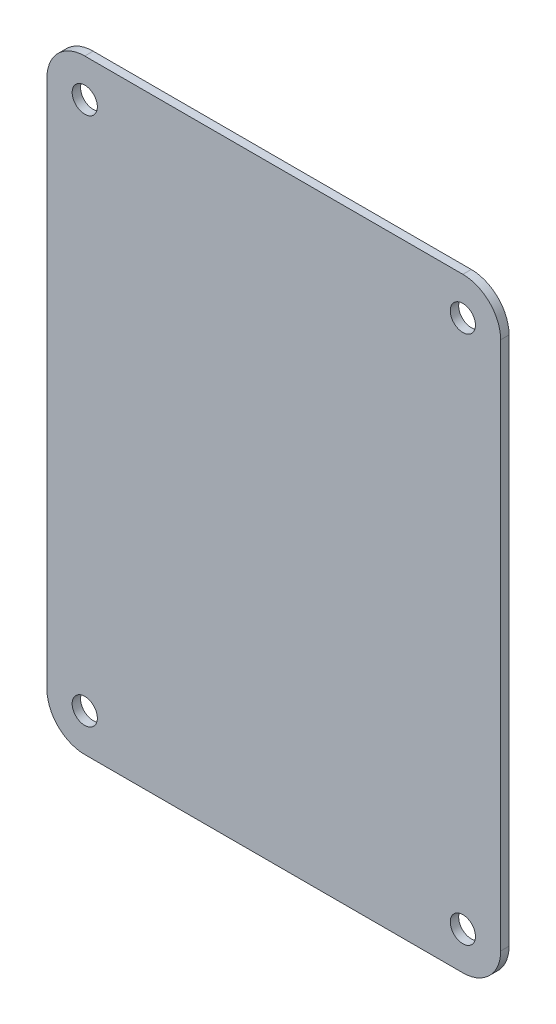
ISO-10303-21;
HEADER;
FILE_DESCRIPTION(('STEP AP214'),'2;1');
FILE_NAME('part.step','',(''),(''),'','','');
FILE_SCHEMA(('AUTOMOTIVE_DESIGN { 1 0 10303 214 1 1 1 1 }'));
ENDSEC;
DATA;
#1=APPLICATION_CONTEXT('core data for automotive mechanical design processes');
#2=APPLICATION_PROTOCOL_DEFINITION('international standard','automotive_design',2000,#1);
#3=PRODUCT_CONTEXT('',#1,'mechanical');
#4=PRODUCT('Part','Part','',(#3));
#5=PRODUCT_RELATED_PRODUCT_CATEGORY('part','',(#4));
#6=PRODUCT_DEFINITION_FORMATION('','',#4);
#7=PRODUCT_DEFINITION_CONTEXT('part definition',#1,'design');
#8=PRODUCT_DEFINITION('design','',#6,#7);
#9=PRODUCT_DEFINITION_SHAPE('','',#8);
#10=(LENGTH_UNIT() NAMED_UNIT(*) SI_UNIT(.MILLI.,.METRE.));
#11=(NAMED_UNIT(*) PLANE_ANGLE_UNIT() SI_UNIT($,.RADIAN.));
#12=(NAMED_UNIT(*) SI_UNIT($,.STERADIAN.) SOLID_ANGLE_UNIT());
#13=UNCERTAINTY_MEASURE_WITH_UNIT(LENGTH_MEASURE(1.E-05),#10,'distance_accuracy_value','');
#14=(GEOMETRIC_REPRESENTATION_CONTEXT(3) GLOBAL_UNCERTAINTY_ASSIGNED_CONTEXT((#13)) GLOBAL_UNIT_ASSIGNED_CONTEXT((#10,
#11,#12)) REPRESENTATION_CONTEXT('',''));
#15=CARTESIAN_POINT('',(0.,0.,0.));
#16=DIRECTION('',(0.,0.,1.));
#17=DIRECTION('',(1.,0.,0.));
#18=AXIS2_PLACEMENT_3D('',#15,#16,#17);
#19=CARTESIAN_POINT('',(-101.443383637,119.056539338,1.));
#20=DIRECTION('',(0.,0.,1.));
#21=DIRECTION('',(1.,0.,0.));
#22=AXIS2_PLACEMENT_3D('',#19,#20,#21);
#23=PLANE('',#22);
#24=CARTESIAN_POINT('',(-101.443383637,56.056539338,1.));
#25=DIRECTION('',(0.,0.,1.));
#26=DIRECTION('',(1.,0.,0.));
#27=AXIS2_PLACEMENT_3D('',#24,#25,#26);
#28=CIRCLE('',#27,1.5);
#29=CARTESIAN_POINT('',(-99.943383637,56.056539338,1.));
#30=VERTEX_POINT('',#29);
#31=EDGE_CURVE('E188',#30,#30,#28,.T.);
#32=ORIENTED_EDGE('',*,*,#31,.F.);
#33=EDGE_LOOP('',(#32));
#34=FACE_BOUND('',#33,.T.);
#35=CARTESIAN_POINT('',(-101.443383637,119.056539338,1.));
#36=DIRECTION('',(0.,0.,1.));
#37=DIRECTION('',(1.,0.,0.));
#38=AXIS2_PLACEMENT_3D('',#35,#36,#37);
#39=CIRCLE('',#38,1.5);
#40=CARTESIAN_POINT('',(-99.943383637,119.056539338,1.));
#41=VERTEX_POINT('',#40);
#42=EDGE_CURVE('E134',#41,#41,#39,.T.);
#43=ORIENTED_EDGE('',*,*,#42,.F.);
#44=EDGE_LOOP('',(#43));
#45=FACE_BOUND('',#44,.T.);
#46=CARTESIAN_POINT('',(-101.443383637,119.056539338,1.));
#47=DIRECTION('',(0.,0.,1.));
#48=DIRECTION('',(1.,0.,0.));
#49=AXIS2_PLACEMENT_3D('',#46,#47,#48);
#50=CIRCLE('',#49,4.5);
#51=CARTESIAN_POINT('',(-101.443383637,123.556539338,1.));
#52=VERTEX_POINT('',#51);
#53=CARTESIAN_POINT('',(-105.943383637,119.056539338,1.));
#54=VERTEX_POINT('',#53);
#55=EDGE_CURVE('E145',#52,#54,#50,.T.);
#56=ORIENTED_EDGE('',*,*,#55,.T.);
#57=DIRECTION('',(0.,-1.,0.));
#58=VECTOR('',#57,1.);
#59=CARTESIAN_POINT('',(-105.943383637,119.056539338,1.));
#60=LINE('',#59,#58);
#61=CARTESIAN_POINT('',(-105.943383637,56.056539338,1.));
#62=VERTEX_POINT('',#61);
#63=EDGE_CURVE('E93',#54,#62,#60,.T.);
#64=ORIENTED_EDGE('',*,*,#63,.T.);
#65=CARTESIAN_POINT('',(-101.443383637,56.056539338,1.));
#66=DIRECTION('',(0.,0.,1.));
#67=DIRECTION('',(1.,0.,0.));
#68=AXIS2_PLACEMENT_3D('',#65,#66,#67);
#69=CIRCLE('',#68,4.5);
#70=CARTESIAN_POINT('',(-101.443383637,51.556539338,1.));
#71=VERTEX_POINT('',#70);
#72=EDGE_CURVE('E160',#62,#71,#69,.T.);
#73=ORIENTED_EDGE('',*,*,#72,.T.);
#74=DIRECTION('',(1.,0.,0.));
#75=VECTOR('',#74,1.);
#76=CARTESIAN_POINT('',(-101.443383637,51.556539338,1.));
#77=LINE('',#76,#75);
#78=CARTESIAN_POINT('',(-56.443383637,51.556539338,1.));
#79=VERTEX_POINT('',#78);
#80=EDGE_CURVE('E173',#71,#79,#77,.T.);
#81=ORIENTED_EDGE('',*,*,#80,.T.);
#82=CARTESIAN_POINT('',(-56.443383637,56.056539338,1.));
#83=DIRECTION('',(0.,0.,1.));
#84=DIRECTION('',(1.,0.,0.));
#85=AXIS2_PLACEMENT_3D('',#82,#83,#84);
#86=CIRCLE('',#85,4.5);
#87=CARTESIAN_POINT('',(-51.943383637,56.056539338,1.));
#88=VERTEX_POINT('',#87);
#89=EDGE_CURVE('E112',#79,#88,#86,.T.);
#90=ORIENTED_EDGE('',*,*,#89,.T.);
#91=DIRECTION('',(0.,1.,0.));
#92=VECTOR('',#91,1.);
#93=CARTESIAN_POINT('',(-51.943383637,56.056539338,1.));
#94=LINE('',#93,#92);
#95=CARTESIAN_POINT('',(-51.943383637,119.056539338,1.));
#96=VERTEX_POINT('',#95);
#97=EDGE_CURVE('E106',#88,#96,#94,.T.);
#98=ORIENTED_EDGE('',*,*,#97,.T.);
#99=CARTESIAN_POINT('',(-56.443383637,119.056539338,1.));
#100=DIRECTION('',(0.,0.,1.));
#101=DIRECTION('',(1.,0.,0.));
#102=AXIS2_PLACEMENT_3D('',#99,#100,#101);
#103=CIRCLE('',#102,4.5);
#104=CARTESIAN_POINT('',(-56.443383637,123.556539338,1.));
#105=VERTEX_POINT('',#104);
#106=EDGE_CURVE('E110',#96,#105,#103,.T.);
#107=ORIENTED_EDGE('',*,*,#106,.T.);
#108=DIRECTION('',(-1.,0.,0.));
#109=VECTOR('',#108,1.);
#110=CARTESIAN_POINT('',(-56.443383637,123.556539338,1.));
#111=LINE('',#110,#109);
#112=EDGE_CURVE('E50',#105,#52,#111,.T.);
#113=ORIENTED_EDGE('',*,*,#112,.T.);
#114=EDGE_LOOP('',(#56,#64,#73,#81,#90,#98,#107,#113));
#115=FACE_BOUND('',#114,.T.);
#116=CARTESIAN_POINT('',(-56.443383637,119.056539338,1.));
#117=DIRECTION('',(0.,0.,1.));
#118=DIRECTION('',(1.,0.,0.));
#119=AXIS2_PLACEMENT_3D('',#116,#117,#118);
#120=CIRCLE('',#119,1.5);
#121=CARTESIAN_POINT('',(-54.943383637,119.056539338,1.));
#122=VERTEX_POINT('',#121);
#123=EDGE_CURVE('E182',#122,#122,#120,.T.);
#124=ORIENTED_EDGE('',*,*,#123,.F.);
#125=EDGE_LOOP('',(#124));
#126=FACE_BOUND('',#125,.T.);
#127=CARTESIAN_POINT('',(-56.443383637,56.056539338,1.));
#128=DIRECTION('',(0.,0.,1.));
#129=DIRECTION('',(1.,0.,0.));
#130=AXIS2_PLACEMENT_3D('',#127,#128,#129);
#131=CIRCLE('',#130,1.5);
#132=CARTESIAN_POINT('',(-54.943383637,56.056539338,1.));
#133=VERTEX_POINT('',#132);
#134=EDGE_CURVE('E194',#133,#133,#131,.T.);
#135=ORIENTED_EDGE('',*,*,#134,.F.);
#136=EDGE_LOOP('',(#135));
#137=FACE_BOUND('',#136,.T.);
#138=ADVANCED_FACE('F33',(#34,#45,#115,#126,#137),#23,.T.);
#139=CARTESIAN_POINT('',(-101.443383637,119.056539338,0.));
#140=DIRECTION('',(0.,0.,1.));
#141=DIRECTION('',(1.,0.,0.));
#142=AXIS2_PLACEMENT_3D('',#139,#140,#141);
#143=PLANE('',#142);
#144=CARTESIAN_POINT('',(-101.443383637,56.056539338,0.));
#145=DIRECTION('',(0.,0.,1.));
#146=DIRECTION('',(1.,0.,0.));
#147=AXIS2_PLACEMENT_3D('',#144,#145,#146);
#148=CIRCLE('',#147,1.5);
#149=CARTESIAN_POINT('',(-99.943383637,56.056539338,0.));
#150=VERTEX_POINT('',#149);
#151=EDGE_CURVE('E191',#150,#150,#148,.T.);
#152=ORIENTED_EDGE('',*,*,#151,.T.);
#153=EDGE_LOOP('',(#152));
#154=FACE_BOUND('',#153,.T.);
#155=CARTESIAN_POINT('',(-101.443383637,119.056539338,0.));
#156=DIRECTION('',(0.,0.,1.));
#157=DIRECTION('',(1.,0.,0.));
#158=AXIS2_PLACEMENT_3D('',#155,#156,#157);
#159=CIRCLE('',#158,1.5);
#160=CARTESIAN_POINT('',(-99.943383637,119.056539338,0.));
#161=VERTEX_POINT('',#160);
#162=EDGE_CURVE('E179',#161,#161,#159,.T.);
#163=ORIENTED_EDGE('',*,*,#162,.T.);
#164=EDGE_LOOP('',(#163));
#165=FACE_BOUND('',#164,.T.);
#166=CARTESIAN_POINT('',(-101.443383637,119.056539338,0.));
#167=DIRECTION('',(0.,0.,1.));
#168=DIRECTION('',(1.,0.,0.));
#169=AXIS2_PLACEMENT_3D('',#166,#167,#168);
#170=CIRCLE('',#169,4.5);
#171=CARTESIAN_POINT('',(-101.443383637,123.556539338,0.));
#172=VERTEX_POINT('',#171);
#173=CARTESIAN_POINT('',(-105.943383637,119.056539338,0.));
#174=VERTEX_POINT('',#173);
#175=EDGE_CURVE('E130',#172,#174,#170,.T.);
#176=ORIENTED_EDGE('',*,*,#175,.F.);
#177=DIRECTION('',(-1.,0.,0.));
#178=VECTOR('',#177,1.);
#179=CARTESIAN_POINT('',(-56.443383637,123.556539338,0.));
#180=LINE('',#179,#178);
#181=CARTESIAN_POINT('',(-56.443383637,123.556539338,0.));
#182=VERTEX_POINT('',#181);
#183=EDGE_CURVE('E85',#182,#172,#180,.T.);
#184=ORIENTED_EDGE('',*,*,#183,.F.);
#185=CARTESIAN_POINT('',(-56.443383637,119.056539338,0.));
#186=DIRECTION('',(0.,0.,1.));
#187=DIRECTION('',(1.,0.,0.));
#188=AXIS2_PLACEMENT_3D('',#185,#186,#187);
#189=CIRCLE('',#188,4.5);
#190=CARTESIAN_POINT('',(-51.943383637,119.056539338,0.));
#191=VERTEX_POINT('',#190);
#192=EDGE_CURVE('E79',#191,#182,#189,.T.);
#193=ORIENTED_EDGE('',*,*,#192,.F.);
#194=DIRECTION('',(0.,1.,0.));
#195=VECTOR('',#194,1.);
#196=CARTESIAN_POINT('',(-51.943383637,56.056539338,0.));
#197=LINE('',#196,#195);
#198=CARTESIAN_POINT('',(-51.943383637,56.056539338,0.));
#199=VERTEX_POINT('',#198);
#200=EDGE_CURVE('E120',#199,#191,#197,.T.);
#201=ORIENTED_EDGE('',*,*,#200,.F.);
#202=CARTESIAN_POINT('',(-56.443383637,56.056539338,0.));
#203=DIRECTION('',(0.,0.,1.));
#204=DIRECTION('',(1.,0.,0.));
#205=AXIS2_PLACEMENT_3D('',#202,#203,#204);
#206=CIRCLE('',#205,4.5);
#207=CARTESIAN_POINT('',(-56.443383637,51.556539338,0.));
#208=VERTEX_POINT('',#207);
#209=EDGE_CURVE('E140',#208,#199,#206,.T.);
#210=ORIENTED_EDGE('',*,*,#209,.F.);
#211=DIRECTION('',(1.,0.,0.));
#212=VECTOR('',#211,1.);
#213=CARTESIAN_POINT('',(-101.443383637,51.556539338,0.));
#214=LINE('',#213,#212);
#215=CARTESIAN_POINT('',(-101.443383637,51.556539338,0.));
#216=VERTEX_POINT('',#215);
#217=EDGE_CURVE('E138',#216,#208,#214,.T.);
#218=ORIENTED_EDGE('',*,*,#217,.F.);
#219=CARTESIAN_POINT('',(-101.443383637,56.056539338,0.));
#220=DIRECTION('',(0.,0.,1.));
#221=DIRECTION('',(1.,0.,0.));
#222=AXIS2_PLACEMENT_3D('',#219,#220,#221);
#223=CIRCLE('',#222,4.5);
#224=CARTESIAN_POINT('',(-105.943383637,56.056539338,0.));
#225=VERTEX_POINT('',#224);
#226=EDGE_CURVE('E136',#225,#216,#223,.T.);
#227=ORIENTED_EDGE('',*,*,#226,.F.);
#228=DIRECTION('',(0.,-1.,0.));
#229=VECTOR('',#228,1.);
#230=CARTESIAN_POINT('',(-105.943383637,119.056539338,0.));
#231=LINE('',#230,#229);
#232=EDGE_CURVE('E133',#174,#225,#231,.T.);
#233=ORIENTED_EDGE('',*,*,#232,.F.);
#234=EDGE_LOOP('',(#176,#184,#193,#201,#210,#218,#227,#233));
#235=FACE_BOUND('',#234,.T.);
#236=CARTESIAN_POINT('',(-56.443383637,119.056539338,0.));
#237=DIRECTION('',(0.,0.,1.));
#238=DIRECTION('',(1.,0.,0.));
#239=AXIS2_PLACEMENT_3D('',#236,#237,#238);
#240=CIRCLE('',#239,1.5);
#241=CARTESIAN_POINT('',(-54.943383637,119.056539338,0.));
#242=VERTEX_POINT('',#241);
#243=EDGE_CURVE('E185',#242,#242,#240,.T.);
#244=ORIENTED_EDGE('',*,*,#243,.T.);
#245=EDGE_LOOP('',(#244));
#246=FACE_BOUND('',#245,.T.);
#247=CARTESIAN_POINT('',(-56.443383637,56.056539338,0.));
#248=DIRECTION('',(0.,0.,1.));
#249=DIRECTION('',(1.,0.,0.));
#250=AXIS2_PLACEMENT_3D('',#247,#248,#249);
#251=CIRCLE('',#250,1.5);
#252=CARTESIAN_POINT('',(-54.943383637,56.056539338,0.));
#253=VERTEX_POINT('',#252);
#254=EDGE_CURVE('E197',#253,#253,#251,.T.);
#255=ORIENTED_EDGE('',*,*,#254,.T.);
#256=EDGE_LOOP('',(#255));
#257=FACE_BOUND('',#256,.T.);
#258=ADVANCED_FACE('F164',(#154,#165,#235,#246,#257),#143,.F.);
#259=CARTESIAN_POINT('',(-101.443383637,119.056539338,1.));
#260=DIRECTION('',(0.,0.,-1.));
#261=DIRECTION('',(-1.,0.,0.));
#262=AXIS2_PLACEMENT_3D('',#259,#260,#261);
#263=CYLINDRICAL_SURFACE('',#262,4.5);
#264=ORIENTED_EDGE('',*,*,#175,.T.);
#265=DIRECTION('',(0.,0.,-1.));
#266=VECTOR('',#265,1.);
#267=CARTESIAN_POINT('',(-105.943383637,119.056539338,1.));
#268=LINE('',#267,#266);
#269=EDGE_CURVE('E11',#54,#174,#268,.T.);
#270=ORIENTED_EDGE('',*,*,#269,.F.);
#271=ORIENTED_EDGE('',*,*,#55,.F.);
#272=DIRECTION('',(0.,0.,-1.));
#273=VECTOR('',#272,1.);
#274=CARTESIAN_POINT('',(-101.443383637,123.556539338,1.));
#275=LINE('',#274,#273);
#276=EDGE_CURVE('E126',#52,#172,#275,.T.);
#277=ORIENTED_EDGE('',*,*,#276,.T.);
#278=EDGE_LOOP('',(#264,#270,#271,#277));
#279=FACE_BOUND('',#278,.T.);
#280=ADVANCED_FACE('F35',(#279),#263,.T.);
#281=CARTESIAN_POINT('',(-105.943383637,119.056539338,1.));
#282=DIRECTION('',(1.,0.,0.));
#283=DIRECTION('',(0.,0.,-1.));
#284=AXIS2_PLACEMENT_3D('',#281,#282,#283);
#285=PLANE('',#284);
#286=ORIENTED_EDGE('',*,*,#232,.T.);
#287=DIRECTION('',(0.,0.,-1.));
#288=VECTOR('',#287,1.);
#289=CARTESIAN_POINT('',(-105.943383637,56.056539338,1.));
#290=LINE('',#289,#288);
#291=EDGE_CURVE('E42',#62,#225,#290,.T.);
#292=ORIENTED_EDGE('',*,*,#291,.F.);
#293=ORIENTED_EDGE('',*,*,#63,.F.);
#294=ORIENTED_EDGE('',*,*,#269,.T.);
#295=EDGE_LOOP('',(#286,#292,#293,#294));
#296=FACE_BOUND('',#295,.T.);
#297=ADVANCED_FACE('F232',(#296),#285,.F.);
#298=CARTESIAN_POINT('',(-101.443383637,56.056539338,1.));
#299=DIRECTION('',(0.,0.,-1.));
#300=DIRECTION('',(-1.,0.,0.));
#301=AXIS2_PLACEMENT_3D('',#298,#299,#300);
#302=CYLINDRICAL_SURFACE('',#301,4.5);
#303=ORIENTED_EDGE('',*,*,#226,.T.);
#304=DIRECTION('',(0.,0.,-1.));
#305=VECTOR('',#304,1.);
#306=CARTESIAN_POINT('',(-101.443383637,51.556539338,1.));
#307=LINE('',#306,#305);
#308=EDGE_CURVE('E152',#71,#216,#307,.T.);
#309=ORIENTED_EDGE('',*,*,#308,.F.);
#310=ORIENTED_EDGE('',*,*,#72,.F.);
#311=ORIENTED_EDGE('',*,*,#291,.T.);
#312=EDGE_LOOP('',(#303,#309,#310,#311));
#313=FACE_BOUND('',#312,.T.);
#314=ADVANCED_FACE('F158',(#313),#302,.T.);
#315=CARTESIAN_POINT('',(-101.443383637,51.556539338,1.));
#316=DIRECTION('',(0.,1.,0.));
#317=DIRECTION('',(0.,0.,1.));
#318=AXIS2_PLACEMENT_3D('',#315,#316,#317);
#319=PLANE('',#318);
#320=ORIENTED_EDGE('',*,*,#217,.T.);
#321=DIRECTION('',(0.,0.,-1.));
#322=VECTOR('',#321,1.);
#323=CARTESIAN_POINT('',(-56.443383637,51.556539338,1.));
#324=LINE('',#323,#322);
#325=EDGE_CURVE('E149',#79,#208,#324,.T.);
#326=ORIENTED_EDGE('',*,*,#325,.F.);
#327=ORIENTED_EDGE('',*,*,#80,.F.);
#328=ORIENTED_EDGE('',*,*,#308,.T.);
#329=EDGE_LOOP('',(#320,#326,#327,#328));
#330=FACE_BOUND('',#329,.T.);
#331=ADVANCED_FACE('F169',(#330),#319,.F.);
#332=CARTESIAN_POINT('',(-56.443383637,56.056539338,1.));
#333=DIRECTION('',(0.,0.,-1.));
#334=DIRECTION('',(-1.,0.,0.));
#335=AXIS2_PLACEMENT_3D('',#332,#333,#334);
#336=CYLINDRICAL_SURFACE('',#335,4.5);
#337=ORIENTED_EDGE('',*,*,#209,.T.);
#338=DIRECTION('',(0.,0.,-1.));
#339=VECTOR('',#338,1.);
#340=CARTESIAN_POINT('',(-51.943383637,56.056539338,1.));
#341=LINE('',#340,#339);
#342=EDGE_CURVE('E121',#88,#199,#341,.T.);
#343=ORIENTED_EDGE('',*,*,#342,.F.);
#344=ORIENTED_EDGE('',*,*,#89,.F.);
#345=ORIENTED_EDGE('',*,*,#325,.T.);
#346=EDGE_LOOP('',(#337,#343,#344,#345));
#347=FACE_BOUND('',#346,.T.);
#348=ADVANCED_FACE('F172',(#347),#336,.T.);
#349=CARTESIAN_POINT('',(-51.943383637,56.056539338,1.));
#350=DIRECTION('',(-1.,0.,0.));
#351=DIRECTION('',(0.,0.,1.));
#352=AXIS2_PLACEMENT_3D('',#349,#350,#351);
#353=PLANE('',#352);
#354=ORIENTED_EDGE('',*,*,#200,.T.);
#355=DIRECTION('',(0.,0.,-1.));
#356=VECTOR('',#355,1.);
#357=CARTESIAN_POINT('',(-51.943383637,119.056539338,1.));
#358=LINE('',#357,#356);
#359=EDGE_CURVE('E117',#96,#191,#358,.T.);
#360=ORIENTED_EDGE('',*,*,#359,.F.);
#361=ORIENTED_EDGE('',*,*,#97,.F.);
#362=ORIENTED_EDGE('',*,*,#342,.T.);
#363=EDGE_LOOP('',(#354,#360,#361,#362));
#364=FACE_BOUND('',#363,.T.);
#365=ADVANCED_FACE('F118',(#364),#353,.F.);
#366=CARTESIAN_POINT('',(-56.443383637,119.056539338,1.));
#367=DIRECTION('',(0.,0.,-1.));
#368=DIRECTION('',(-1.,0.,0.));
#369=AXIS2_PLACEMENT_3D('',#366,#367,#368);
#370=CYLINDRICAL_SURFACE('',#369,4.5);
#371=ORIENTED_EDGE('',*,*,#192,.T.);
#372=DIRECTION('',(0.,0.,-1.));
#373=VECTOR('',#372,1.);
#374=CARTESIAN_POINT('',(-56.443383637,123.556539338,1.));
#375=LINE('',#374,#373);
#376=EDGE_CURVE('E122',#105,#182,#375,.T.);
#377=ORIENTED_EDGE('',*,*,#376,.F.);
#378=ORIENTED_EDGE('',*,*,#106,.F.);
#379=ORIENTED_EDGE('',*,*,#359,.T.);
#380=EDGE_LOOP('',(#371,#377,#378,#379));
#381=FACE_BOUND('',#380,.T.);
#382=ADVANCED_FACE('F124',(#381),#370,.T.);
#383=CARTESIAN_POINT('',(-56.443383637,123.556539338,1.));
#384=DIRECTION('',(0.,-1.,0.));
#385=DIRECTION('',(0.,0.,-1.));
#386=AXIS2_PLACEMENT_3D('',#383,#384,#385);
#387=PLANE('',#386);
#388=ORIENTED_EDGE('',*,*,#183,.T.);
#389=ORIENTED_EDGE('',*,*,#276,.F.);
#390=ORIENTED_EDGE('',*,*,#112,.F.);
#391=ORIENTED_EDGE('',*,*,#376,.T.);
#392=EDGE_LOOP('',(#388,#389,#390,#391));
#393=FACE_BOUND('',#392,.T.);
#394=ADVANCED_FACE('F220',(#393),#387,.F.);
#395=CARTESIAN_POINT('',(-101.443383637,119.056539338,1.));
#396=DIRECTION('',(0.,0.,-1.));
#397=DIRECTION('',(-1.,0.,0.));
#398=AXIS2_PLACEMENT_3D('',#395,#396,#397);
#399=CYLINDRICAL_SURFACE('',#398,1.5);
#400=ORIENTED_EDGE('',*,*,#42,.T.);
#401=EDGE_LOOP('',(#400));
#402=FACE_BOUND('',#401,.T.);
#403=ORIENTED_EDGE('',*,*,#162,.F.);
#404=EDGE_LOOP('',(#403));
#405=FACE_BOUND('',#404,.T.);
#406=ADVANCED_FACE('F217',(#402,#405),#399,.F.);
#407=CARTESIAN_POINT('',(-56.443383637,119.056539338,1.));
#408=DIRECTION('',(0.,0.,-1.));
#409=DIRECTION('',(-1.,0.,0.));
#410=AXIS2_PLACEMENT_3D('',#407,#408,#409);
#411=CYLINDRICAL_SURFACE('',#410,1.5);
#412=ORIENTED_EDGE('',*,*,#123,.T.);
#413=EDGE_LOOP('',(#412));
#414=FACE_BOUND('',#413,.T.);
#415=ORIENTED_EDGE('',*,*,#243,.F.);
#416=EDGE_LOOP('',(#415));
#417=FACE_BOUND('',#416,.T.);
#418=ADVANCED_FACE('F296',(#414,#417),#411,.F.);
#419=CARTESIAN_POINT('',(-101.443383637,56.056539338,1.));
#420=DIRECTION('',(0.,0.,-1.));
#421=DIRECTION('',(-1.,0.,0.));
#422=AXIS2_PLACEMENT_3D('',#419,#420,#421);
#423=CYLINDRICAL_SURFACE('',#422,1.5);
#424=ORIENTED_EDGE('',*,*,#31,.T.);
#425=EDGE_LOOP('',(#424));
#426=FACE_BOUND('',#425,.T.);
#427=ORIENTED_EDGE('',*,*,#151,.F.);
#428=EDGE_LOOP('',(#427));
#429=FACE_BOUND('',#428,.T.);
#430=ADVANCED_FACE('F304',(#426,#429),#423,.F.);
#431=CARTESIAN_POINT('',(-56.443383637,56.056539338,1.));
#432=DIRECTION('',(0.,0.,-1.));
#433=DIRECTION('',(-1.,0.,0.));
#434=AXIS2_PLACEMENT_3D('',#431,#432,#433);
#435=CYLINDRICAL_SURFACE('',#434,1.5);
#436=ORIENTED_EDGE('',*,*,#134,.T.);
#437=EDGE_LOOP('',(#436));
#438=FACE_BOUND('',#437,.T.);
#439=ORIENTED_EDGE('',*,*,#254,.F.);
#440=EDGE_LOOP('',(#439));
#441=FACE_BOUND('',#440,.T.);
#442=ADVANCED_FACE('F203',(#438,#441),#435,.F.);
#443=CLOSED_SHELL('',(#138,#258,#280,#297,#314,#331,#348,#365,#382,#394,#406,#418,#430,#442));
#444=MANIFOLD_SOLID_BREP('B2',#443);
#445=ADVANCED_BREP_SHAPE_REPRESENTATION('',(#18,#444),#14);
#446=SHAPE_DEFINITION_REPRESENTATION(#9,#445);
ENDSEC;
END-ISO-10303-21;
